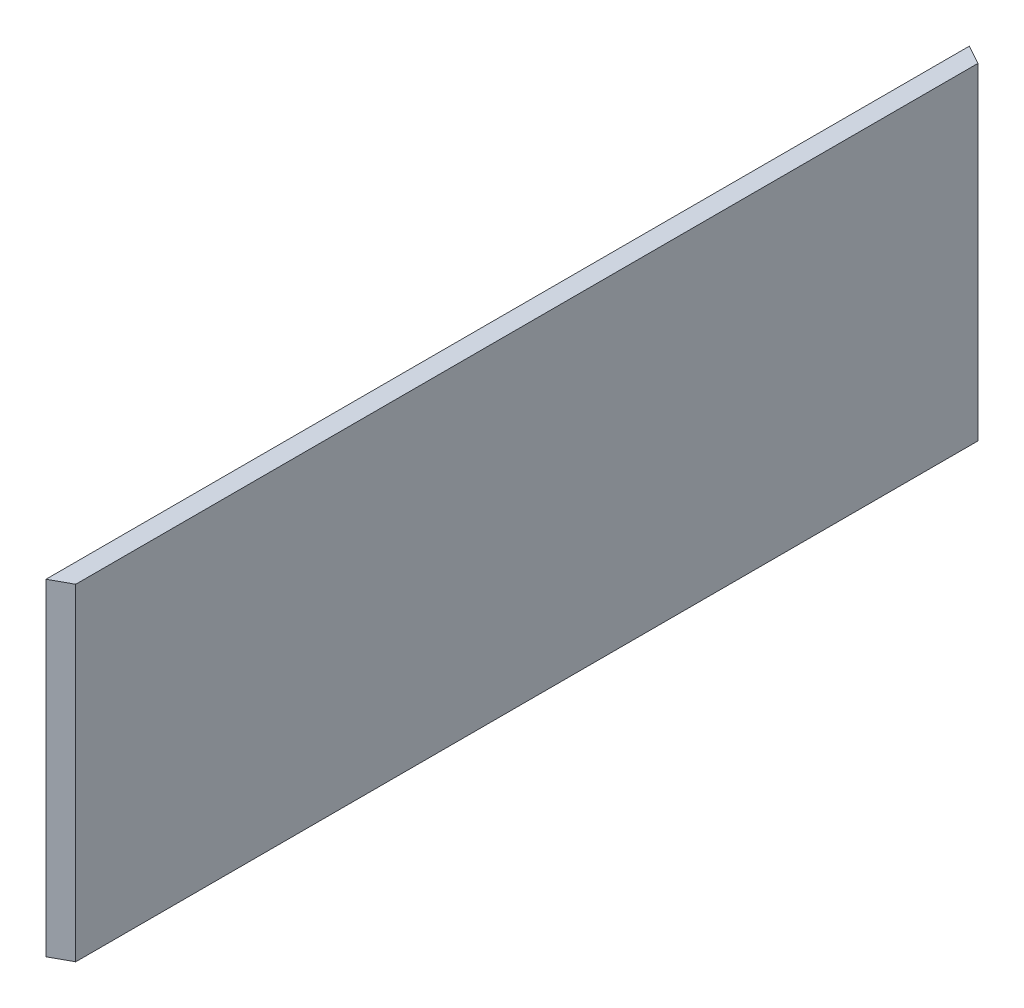
ISO-10303-21;
HEADER;
FILE_DESCRIPTION(('STEP AP214'),'2;1');
FILE_NAME('part.step','',(''),(''),'','','');
FILE_SCHEMA(('AUTOMOTIVE_DESIGN { 1 0 10303 214 1 1 1 1 }'));
ENDSEC;
DATA;
#1=APPLICATION_CONTEXT('core data for automotive mechanical design processes');
#2=APPLICATION_PROTOCOL_DEFINITION('international standard','automotive_design',2000,#1);
#3=PRODUCT_CONTEXT('',#1,'mechanical');
#4=PRODUCT('Part','Part','',(#3));
#5=PRODUCT_RELATED_PRODUCT_CATEGORY('part','',(#4));
#6=PRODUCT_DEFINITION_FORMATION('','',#4);
#7=PRODUCT_DEFINITION_CONTEXT('part definition',#1,'design');
#8=PRODUCT_DEFINITION('design','',#6,#7);
#9=PRODUCT_DEFINITION_SHAPE('','',#8);
#10=(LENGTH_UNIT() NAMED_UNIT(*) SI_UNIT(.MILLI.,.METRE.));
#11=(NAMED_UNIT(*) PLANE_ANGLE_UNIT() SI_UNIT($,.RADIAN.));
#12=(NAMED_UNIT(*) SI_UNIT($,.STERADIAN.) SOLID_ANGLE_UNIT());
#13=UNCERTAINTY_MEASURE_WITH_UNIT(LENGTH_MEASURE(1.E-05),#10,'distance_accuracy_value','');
#14=(GEOMETRIC_REPRESENTATION_CONTEXT(3) GLOBAL_UNCERTAINTY_ASSIGNED_CONTEXT((#13)) GLOBAL_UNIT_ASSIGNED_CONTEXT((#10,
#11,#12)) REPRESENTATION_CONTEXT('',''));
#15=CARTESIAN_POINT('',(0.,0.,0.));
#16=DIRECTION('',(0.,0.,1.));
#17=DIRECTION('',(1.,0.,0.));
#18=AXIS2_PLACEMENT_3D('',#15,#16,#17);
#19=CARTESIAN_POINT('',(0.,0.,0.));
#20=DIRECTION('',(1.,0.,0.));
#21=DIRECTION('',(0.,0.,-1.));
#22=AXIS2_PLACEMENT_3D('',#19,#20,#21);
#23=PLANE('',#22);
#24=DIRECTION('',(0.,1.,0.));
#25=VECTOR('',#24,1.);
#26=CARTESIAN_POINT('',(0.,53.975,-1.73339510016609));
#27=LINE('',#26,#25);
#28=CARTESIAN_POINT('',(0.,53.975,-1.73339510016609));
#29=VERTEX_POINT('',#28);
#30=CARTESIAN_POINT('',(0.,0.,-1.73339510016609));
#31=VERTEX_POINT('',#30);
#32=EDGE_CURVE('E55',#29,#31,#27,.F.);
#33=ORIENTED_EDGE('',*,*,#32,.T.);
#34=DIRECTION('',(0.,0.,1.));
#35=VECTOR('',#34,1.);
#36=CARTESIAN_POINT('',(0.,0.,-76.2));
#37=LINE('',#36,#35);
#38=CARTESIAN_POINT('',(0.,0.,-150.666604899834));
#39=VERTEX_POINT('',#38);
#40=EDGE_CURVE('E20',#31,#39,#37,.F.);
#41=ORIENTED_EDGE('',*,*,#40,.T.);
#42=DIRECTION('',(0.,1.,0.));
#43=VECTOR('',#42,1.);
#44=CARTESIAN_POINT('',(0.,53.975,-150.666604899834));
#45=LINE('',#44,#43);
#46=CARTESIAN_POINT('',(0.,53.975,-150.666604899834));
#47=VERTEX_POINT('',#46);
#48=EDGE_CURVE('E80',#47,#39,#45,.F.);
#49=ORIENTED_EDGE('',*,*,#48,.F.);
#50=DIRECTION('',(0.,0.,1.));
#51=VECTOR('',#50,1.);
#52=CARTESIAN_POINT('',(0.,53.975,-76.2));
#53=LINE('',#52,#51);
#54=EDGE_CURVE('E61',#29,#47,#53,.F.);
#55=ORIENTED_EDGE('',*,*,#54,.F.);
#56=EDGE_LOOP('',(#33,#41,#49,#55));
#57=FACE_BOUND('',#56,.T.);
#58=ADVANCED_FACE('F17',(#57),#23,.T.);
#59=CARTESIAN_POINT('',(-1.5875,0.,-76.2));
#60=DIRECTION('',(0.,1.,0.));
#61=DIRECTION('',(0.,0.,1.));
#62=AXIS2_PLACEMENT_3D('',#59,#60,#61);
#63=PLANE('',#62);
#64=ORIENTED_EDGE('',*,*,#40,.F.);
#65=DIRECTION('',(-0.877712251057235,0.,0.479188067823105));
#66=VECTOR('',#65,1.);
#67=CARTESIAN_POINT('',(-3.175,0.,0.));
#68=LINE('',#67,#66);
#69=CARTESIAN_POINT('',(-3.175,0.,0.));
#70=VERTEX_POINT('',#69);
#71=EDGE_CURVE('E63',#31,#70,#68,.T.);
#72=ORIENTED_EDGE('',*,*,#71,.T.);
#73=DIRECTION('',(0.,0.,1.));
#74=VECTOR('',#73,1.);
#75=CARTESIAN_POINT('',(-3.175,0.,-152.4));
#76=LINE('',#75,#74);
#77=CARTESIAN_POINT('',(-3.175,0.,-152.4));
#78=VERTEX_POINT('',#77);
#79=EDGE_CURVE('E83',#78,#70,#76,.T.);
#80=ORIENTED_EDGE('',*,*,#79,.F.);
#81=DIRECTION('',(-0.877712251057235,0.,-0.479188067823105));
#82=VECTOR('',#81,1.);
#83=CARTESIAN_POINT('',(-3.175,0.,-152.4));
#84=LINE('',#83,#82);
#85=EDGE_CURVE('E68',#39,#78,#84,.T.);
#86=ORIENTED_EDGE('',*,*,#85,.F.);
#87=EDGE_LOOP('',(#64,#72,#80,#86));
#88=FACE_BOUND('',#87,.T.);
#89=ADVANCED_FACE('F65',(#88),#63,.F.);
#90=CARTESIAN_POINT('',(-3.175,53.975,0.));
#91=DIRECTION('',(-0.479188067823105,0.,-0.877712251057235));
#92=DIRECTION('',(-0.877712251057235,0.,0.479188067823105));
#93=AXIS2_PLACEMENT_3D('',#90,#91,#92);
#94=PLANE('',#93);
#95=DIRECTION('',(0.,1.,0.));
#96=VECTOR('',#95,1.);
#97=CARTESIAN_POINT('',(-3.175,0.,0.));
#98=LINE('',#97,#96);
#99=CARTESIAN_POINT('',(-3.175,53.975,0.));
#100=VERTEX_POINT('',#99);
#101=EDGE_CURVE('E72',#70,#100,#98,.T.);
#102=ORIENTED_EDGE('',*,*,#101,.F.);
#103=ORIENTED_EDGE('',*,*,#71,.F.);
#104=ORIENTED_EDGE('',*,*,#32,.F.);
#105=DIRECTION('',(0.877712251057236,0.,-0.479188067823104));
#106=VECTOR('',#105,1.);
#107=CARTESIAN_POINT('',(-3.175,53.975,0.));
#108=LINE('',#107,#106);
#109=EDGE_CURVE('E74',#100,#29,#108,.T.);
#110=ORIENTED_EDGE('',*,*,#109,.F.);
#111=EDGE_LOOP('',(#102,#103,#104,#110));
#112=FACE_BOUND('',#111,.T.);
#113=ADVANCED_FACE('F70',(#112),#94,.F.);
#114=CARTESIAN_POINT('',(-1.5875,53.975,-76.2));
#115=DIRECTION('',(0.,1.,0.));
#116=DIRECTION('',(0.,0.,1.));
#117=AXIS2_PLACEMENT_3D('',#114,#115,#116);
#118=PLANE('',#117);
#119=ORIENTED_EDGE('',*,*,#109,.T.);
#120=ORIENTED_EDGE('',*,*,#54,.T.);
#121=DIRECTION('',(-0.877712251057235,0.,-0.479188067823105));
#122=VECTOR('',#121,1.);
#123=CARTESIAN_POINT('',(-3.175,53.975,-152.4));
#124=LINE('',#123,#122);
#125=CARTESIAN_POINT('',(-3.175,53.975,-152.4));
#126=VERTEX_POINT('',#125);
#127=EDGE_CURVE('E35',#126,#47,#124,.F.);
#128=ORIENTED_EDGE('',*,*,#127,.F.);
#129=DIRECTION('',(0.,0.,1.));
#130=VECTOR('',#129,1.);
#131=CARTESIAN_POINT('',(-3.175,53.975,-152.4));
#132=LINE('',#131,#130);
#133=EDGE_CURVE('E26',#100,#126,#132,.F.);
#134=ORIENTED_EDGE('',*,*,#133,.F.);
#135=EDGE_LOOP('',(#119,#120,#128,#134));
#136=FACE_BOUND('',#135,.T.);
#137=ADVANCED_FACE('F89',(#136),#118,.T.);
#138=CARTESIAN_POINT('',(-3.175,53.975,-152.4));
#139=DIRECTION('',(0.479188067823105,0.,-0.877712251057235));
#140=DIRECTION('',(-0.877712251057235,0.,-0.479188067823105));
#141=AXIS2_PLACEMENT_3D('',#138,#139,#140);
#142=PLANE('',#141);
#143=ORIENTED_EDGE('',*,*,#85,.T.);
#144=DIRECTION('',(0.,1.,0.));
#145=VECTOR('',#144,1.);
#146=CARTESIAN_POINT('',(-3.175,0.,-152.4));
#147=LINE('',#146,#145);
#148=EDGE_CURVE('E11',#126,#78,#147,.F.);
#149=ORIENTED_EDGE('',*,*,#148,.F.);
#150=ORIENTED_EDGE('',*,*,#127,.T.);
#151=ORIENTED_EDGE('',*,*,#48,.T.);
#152=EDGE_LOOP('',(#143,#149,#150,#151));
#153=FACE_BOUND('',#152,.T.);
#154=ADVANCED_FACE('F91',(#153),#142,.T.);
#155=CARTESIAN_POINT('',(-3.175,0.,-152.4));
#156=DIRECTION('',(-1.,0.,0.));
#157=DIRECTION('',(0.,0.,1.));
#158=AXIS2_PLACEMENT_3D('',#155,#156,#157);
#159=PLANE('',#158);
#160=ORIENTED_EDGE('',*,*,#133,.T.);
#161=ORIENTED_EDGE('',*,*,#148,.T.);
#162=ORIENTED_EDGE('',*,*,#79,.T.);
#163=ORIENTED_EDGE('',*,*,#101,.T.);
#164=EDGE_LOOP('',(#160,#161,#162,#163));
#165=FACE_BOUND('',#164,.T.);
#166=ADVANCED_FACE('F88',(#165),#159,.T.);
#167=CLOSED_SHELL('',(#58,#89,#113,#137,#154,#166));
#168=MANIFOLD_SOLID_BREP('B1',#167);
#169=ADVANCED_BREP_SHAPE_REPRESENTATION('',(#18,#168),#14);
#170=SHAPE_DEFINITION_REPRESENTATION(#9,#169);
ENDSEC;
END-ISO-10303-21;
